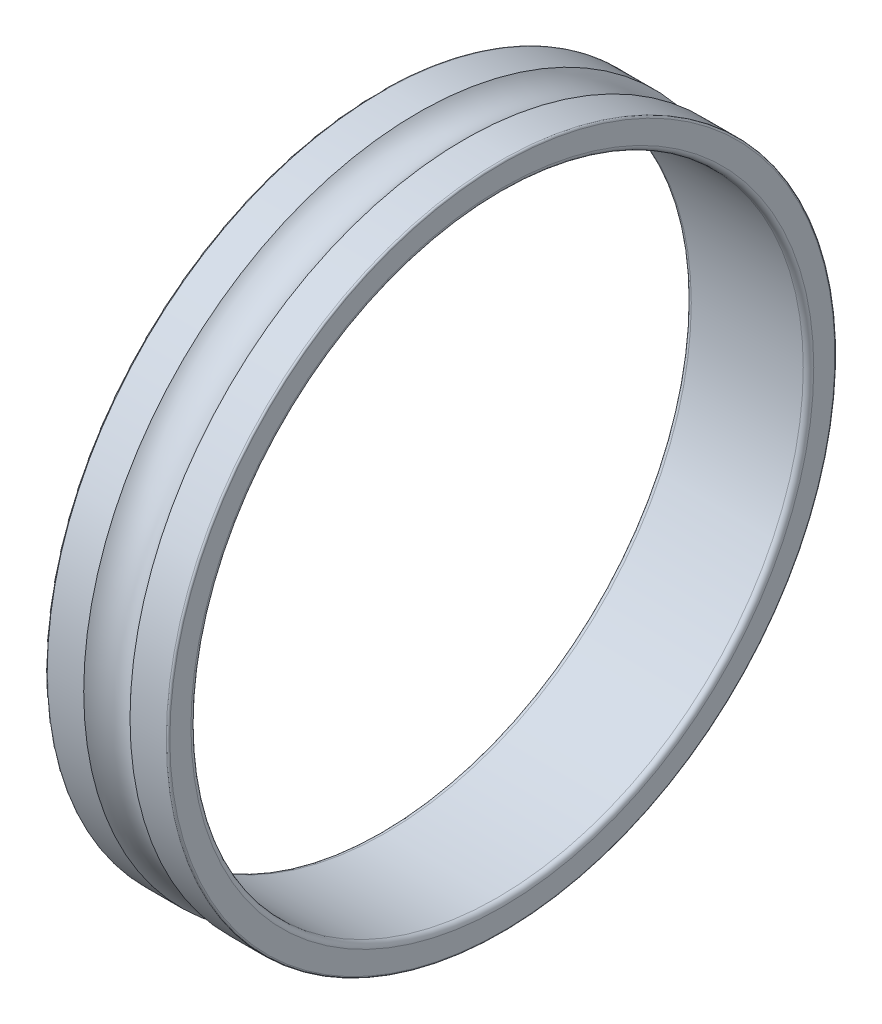
ISO-10303-21;
HEADER;
FILE_DESCRIPTION(('STEP AP214'),'2;1');
FILE_NAME('part.step','',(''),(''),'','','');
FILE_SCHEMA(('AUTOMOTIVE_DESIGN { 1 0 10303 214 1 1 1 1 }'));
ENDSEC;
DATA;
#1=APPLICATION_CONTEXT('core data for automotive mechanical design processes');
#2=APPLICATION_PROTOCOL_DEFINITION('international standard','automotive_design',2000,#1);
#3=PRODUCT_CONTEXT('',#1,'mechanical');
#4=PRODUCT('Part','Part','',(#3));
#5=PRODUCT_RELATED_PRODUCT_CATEGORY('part','',(#4));
#6=PRODUCT_DEFINITION_FORMATION('','',#4);
#7=PRODUCT_DEFINITION_CONTEXT('part definition',#1,'design');
#8=PRODUCT_DEFINITION('design','',#6,#7);
#9=PRODUCT_DEFINITION_SHAPE('','',#8);
#10=(LENGTH_UNIT() NAMED_UNIT(*) SI_UNIT(.MILLI.,.METRE.));
#11=(NAMED_UNIT(*) PLANE_ANGLE_UNIT() SI_UNIT($,.RADIAN.));
#12=(NAMED_UNIT(*) SI_UNIT($,.STERADIAN.) SOLID_ANGLE_UNIT());
#13=UNCERTAINTY_MEASURE_WITH_UNIT(LENGTH_MEASURE(1.E-05),#10,'distance_accuracy_value','');
#14=(GEOMETRIC_REPRESENTATION_CONTEXT(3) GLOBAL_UNCERTAINTY_ASSIGNED_CONTEXT((#13)) GLOBAL_UNIT_ASSIGNED_CONTEXT((#10,
#11,#12)) REPRESENTATION_CONTEXT('',''));
#15=CARTESIAN_POINT('',(0.,0.,0.));
#16=DIRECTION('',(0.,0.,1.));
#17=DIRECTION('',(1.,0.,0.));
#18=AXIS2_PLACEMENT_3D('',#15,#16,#17);
#19=CARTESIAN_POINT('',(0.,-19.3580434128316,-19.005));
#20=DIRECTION('',(-1.,0.,0.));
#21=DIRECTION('',(0.,0.,1.));
#22=AXIS2_PLACEMENT_3D('',#19,#20,#21);
#23=PLANE('',#22);
#24=CARTESIAN_POINT('',(0.,0.,0.));
#25=DIRECTION('',(-1.,0.,0.));
#26=DIRECTION('',(0.,0.,-1.));
#27=AXIS2_PLACEMENT_3D('',#24,#25,#26);
#28=CIRCLE('',#27,19.005000020702);
#29=CARTESIAN_POINT('',(0.,0.,-19.005000020702));
#30=VERTEX_POINT('',#29);
#31=EDGE_CURVE('E50',#30,#30,#28,.F.);
#32=ORIENTED_EDGE('',*,*,#31,.F.);
#33=EDGE_LOOP('',(#32));
#34=FACE_BOUND('',#33,.T.);
#35=CARTESIAN_POINT('',(0.,0.,0.));
#36=DIRECTION('',(1.,0.,0.));
#37=DIRECTION('',(0.,0.,1.));
#38=AXIS2_PLACEMENT_3D('',#35,#36,#37);
#39=CIRCLE('',#38,17.8);
#40=CARTESIAN_POINT('',(0.,0.,17.8));
#41=VERTEX_POINT('',#40);
#42=EDGE_CURVE('E47',#41,#41,#39,.T.);
#43=ORIENTED_EDGE('',*,*,#42,.T.);
#44=EDGE_LOOP('',(#43));
#45=FACE_BOUND('',#44,.T.);
#46=ADVANCED_FACE('F15',(#34,#45),#23,.T.);
#47=CARTESIAN_POINT('',(7.,-19.3580434128316,19.005));
#48=DIRECTION('',(1.,0.,0.));
#49=DIRECTION('',(0.,0.,-1.));
#50=AXIS2_PLACEMENT_3D('',#47,#48,#49);
#51=PLANE('',#50);
#52=CARTESIAN_POINT('',(7.,0.,0.));
#53=DIRECTION('',(1.,0.,0.));
#54=DIRECTION('',(0.,0.,1.));
#55=AXIS2_PLACEMENT_3D('',#52,#53,#54);
#56=CIRCLE('',#55,19.005);
#57=CARTESIAN_POINT('',(7.,0.,19.005));
#58=VERTEX_POINT('',#57);
#59=EDGE_CURVE('E44',#58,#58,#56,.T.);
#60=ORIENTED_EDGE('',*,*,#59,.T.);
#61=EDGE_LOOP('',(#60));
#62=FACE_BOUND('',#61,.T.);
#63=CARTESIAN_POINT('',(7.,0.,0.));
#64=DIRECTION('',(-1.,0.,0.));
#65=DIRECTION('',(0.,0.,-1.));
#66=AXIS2_PLACEMENT_3D('',#63,#64,#65);
#67=CIRCLE('',#66,17.8);
#68=CARTESIAN_POINT('',(7.,0.,-17.8));
#69=VERTEX_POINT('',#68);
#70=EDGE_CURVE('E41',#69,#69,#67,.F.);
#71=ORIENTED_EDGE('',*,*,#70,.F.);
#72=EDGE_LOOP('',(#71));
#73=FACE_BOUND('',#72,.T.);
#74=ADVANCED_FACE('F58',(#62,#73),#51,.T.);
#75=CARTESIAN_POINT('',(0.29999999999994,0.,0.));
#76=DIRECTION('',(1.,0.,0.));
#77=DIRECTION('',(0.,0.,1.));
#78=AXIS2_PLACEMENT_3D('',#75,#76,#77);
#79=TOROIDAL_SURFACE('',#78,17.8,0.29999999999994);
#80=CARTESIAN_POINT('',(0.299999999999994,0.,0.));
#81=DIRECTION('',(1.,0.,0.));
#82=DIRECTION('',(0.,0.,1.));
#83=AXIS2_PLACEMENT_3D('',#80,#81,#82);
#84=CIRCLE('',#83,17.5000000000001);
#85=CARTESIAN_POINT('',(0.299999999999994,0.,17.5000000000001));
#86=VERTEX_POINT('',#85);
#87=EDGE_CURVE('E38',#86,#86,#84,.T.);
#88=ORIENTED_EDGE('',*,*,#87,.T.);
#89=EDGE_LOOP('',(#88));
#90=FACE_BOUND('',#89,.T.);
#91=ORIENTED_EDGE('',*,*,#42,.F.);
#92=EDGE_LOOP('',(#91));
#93=FACE_BOUND('',#92,.T.);
#94=ADVANCED_FACE('F62',(#90,#93),#79,.T.);
#95=CARTESIAN_POINT('',(100.,0.,0.));
#96=DIRECTION('',(1.,0.,0.));
#97=DIRECTION('',(0.,0.,1.));
#98=AXIS2_PLACEMENT_3D('',#95,#96,#97);
#99=CYLINDRICAL_SURFACE('',#98,17.5);
#100=CARTESIAN_POINT('',(6.7,0.,0.));
#101=DIRECTION('',(1.,0.,0.));
#102=DIRECTION('',(0.,0.,1.));
#103=AXIS2_PLACEMENT_3D('',#100,#101,#102);
#104=CIRCLE('',#103,17.5);
#105=CARTESIAN_POINT('',(6.7,0.,17.5));
#106=VERTEX_POINT('',#105);
#107=EDGE_CURVE('E35',#106,#106,#104,.T.);
#108=ORIENTED_EDGE('',*,*,#107,.T.);
#109=EDGE_LOOP('',(#108));
#110=FACE_BOUND('',#109,.T.);
#111=ORIENTED_EDGE('',*,*,#87,.F.);
#112=EDGE_LOOP('',(#111));
#113=FACE_BOUND('',#112,.T.);
#114=ADVANCED_FACE('F64',(#110,#113),#99,.F.);
#115=CARTESIAN_POINT('',(6.70000000000012,0.,0.));
#116=DIRECTION('',(1.,0.,0.));
#117=DIRECTION('',(0.,0.,1.));
#118=AXIS2_PLACEMENT_3D('',#115,#116,#117);
#119=TOROIDAL_SURFACE('',#118,17.8,0.299999999999877);
#120=ORIENTED_EDGE('',*,*,#70,.T.);
#121=EDGE_LOOP('',(#120));
#122=FACE_BOUND('',#121,.T.);
#123=ORIENTED_EDGE('',*,*,#107,.F.);
#124=EDGE_LOOP('',(#123));
#125=FACE_BOUND('',#124,.T.);
#126=ADVANCED_FACE('F72',(#122,#125),#119,.T.);
#127=CARTESIAN_POINT('',(6.90000000000066,0.,0.));
#128=DIRECTION('',(1.,0.,0.));
#129=DIRECTION('',(0.,0.,1.));
#130=AXIS2_PLACEMENT_3D('',#127,#128,#129);
#131=TOROIDAL_SURFACE('',#130,19.0050000000006,0.0999999999993385);
#132=CARTESIAN_POINT('',(6.90000000000066,0.,0.));
#133=DIRECTION('',(1.,0.,0.));
#134=DIRECTION('',(0.,0.,1.));
#135=AXIS2_PLACEMENT_3D('',#132,#133,#134);
#136=CIRCLE('',#135,19.105);
#137=CARTESIAN_POINT('',(6.90000000000066,0.,19.105));
#138=VERTEX_POINT('',#137);
#139=EDGE_CURVE('E30',#138,#138,#136,.T.);
#140=ORIENTED_EDGE('',*,*,#139,.T.);
#141=EDGE_LOOP('',(#140));
#142=FACE_BOUND('',#141,.T.);
#143=ORIENTED_EDGE('',*,*,#59,.F.);
#144=EDGE_LOOP('',(#143));
#145=FACE_BOUND('',#144,.T.);
#146=ADVANCED_FACE('F80',(#142,#145),#131,.T.);
#147=CARTESIAN_POINT('',(100.,0.,0.));
#148=DIRECTION('',(1.,0.,0.));
#149=DIRECTION('',(0.,0.,1.));
#150=AXIS2_PLACEMENT_3D('',#147,#148,#149);
#151=CYLINDRICAL_SURFACE('',#150,19.105);
#152=CARTESIAN_POINT('',(4.8234330357068,0.,0.));
#153=DIRECTION('',(1.,0.,0.));
#154=DIRECTION('',(0.,0.,1.));
#155=AXIS2_PLACEMENT_3D('',#152,#153,#154);
#156=CIRCLE('',#155,19.105);
#157=CARTESIAN_POINT('',(4.8234330357068,0.,19.105));
#158=VERTEX_POINT('',#157);
#159=EDGE_CURVE('E26',#158,#158,#156,.T.);
#160=ORIENTED_EDGE('',*,*,#159,.T.);
#161=EDGE_LOOP('',(#160));
#162=FACE_BOUND('',#161,.T.);
#163=ORIENTED_EDGE('',*,*,#139,.F.);
#164=EDGE_LOOP('',(#163));
#165=FACE_BOUND('',#164,.T.);
#166=ADVANCED_FACE('F84',(#162,#165),#151,.T.);
#167=CARTESIAN_POINT('',(3.5,0.,0.));
#168=DIRECTION('',(1.,0.,0.));
#169=DIRECTION('',(0.,0.,1.));
#170=AXIS2_PLACEMENT_3D('',#167,#168,#169);
#171=TOROIDAL_SURFACE('',#170,20.25,1.7500000000001);
#172=ORIENTED_EDGE('',*,*,#159,.F.);
#173=EDGE_LOOP('',(#172));
#174=FACE_BOUND('',#173,.T.);
#175=CARTESIAN_POINT('',(2.17656696429315,0.,0.));
#176=DIRECTION('',(1.,0.,0.));
#177=DIRECTION('',(0.,0.,1.));
#178=AXIS2_PLACEMENT_3D('',#175,#176,#177);
#179=CIRCLE('',#178,19.105);
#180=CARTESIAN_POINT('',(2.17656696429315,0.,19.105));
#181=VERTEX_POINT('',#180);
#182=EDGE_CURVE('E22',#181,#181,#179,.T.);
#183=ORIENTED_EDGE('',*,*,#182,.T.);
#184=EDGE_LOOP('',(#183));
#185=FACE_BOUND('',#184,.T.);
#186=ADVANCED_FACE('F88',(#174,#185),#171,.F.);
#187=CARTESIAN_POINT('',(100.,0.,0.));
#188=DIRECTION('',(1.,0.,0.));
#189=DIRECTION('',(0.,0.,1.));
#190=AXIS2_PLACEMENT_3D('',#187,#188,#189);
#191=CYLINDRICAL_SURFACE('',#190,19.105);
#192=CARTESIAN_POINT('',(0.100000000000009,0.,0.));
#193=DIRECTION('',(1.,0.,0.));
#194=DIRECTION('',(0.,0.,1.));
#195=AXIS2_PLACEMENT_3D('',#192,#193,#194);
#196=CIRCLE('',#195,19.105);
#197=CARTESIAN_POINT('',(0.100000000000009,0.,19.105));
#198=VERTEX_POINT('',#197);
#199=EDGE_CURVE('E10',#198,#198,#196,.T.);
#200=ORIENTED_EDGE('',*,*,#199,.T.);
#201=EDGE_LOOP('',(#200));
#202=FACE_BOUND('',#201,.T.);
#203=ORIENTED_EDGE('',*,*,#182,.F.);
#204=EDGE_LOOP('',(#203));
#205=FACE_BOUND('',#204,.T.);
#206=ADVANCED_FACE('F91',(#202,#205),#191,.T.);
#207=CARTESIAN_POINT('',(0.0999999999994157,0.,0.));
#208=DIRECTION('',(1.,0.,0.));
#209=DIRECTION('',(0.,0.,1.));
#210=AXIS2_PLACEMENT_3D('',#207,#208,#209);
#211=TOROIDAL_SURFACE('',#210,19.0050000000006,0.09999999999942);
#212=ORIENTED_EDGE('',*,*,#31,.T.);
#213=EDGE_LOOP('',(#212));
#214=FACE_BOUND('',#213,.T.);
#215=ORIENTED_EDGE('',*,*,#199,.F.);
#216=EDGE_LOOP('',(#215));
#217=FACE_BOUND('',#216,.T.);
#218=ADVANCED_FACE('F17',(#214,#217),#211,.T.);
#219=CLOSED_SHELL('',(#46,#74,#94,#114,#126,#146,#166,#186,#206,#218));
#220=MANIFOLD_SOLID_BREP('B1',#219);
#221=ADVANCED_BREP_SHAPE_REPRESENTATION('',(#18,#220),#14);
#222=SHAPE_DEFINITION_REPRESENTATION(#9,#221);
ENDSEC;
END-ISO-10303-21;
